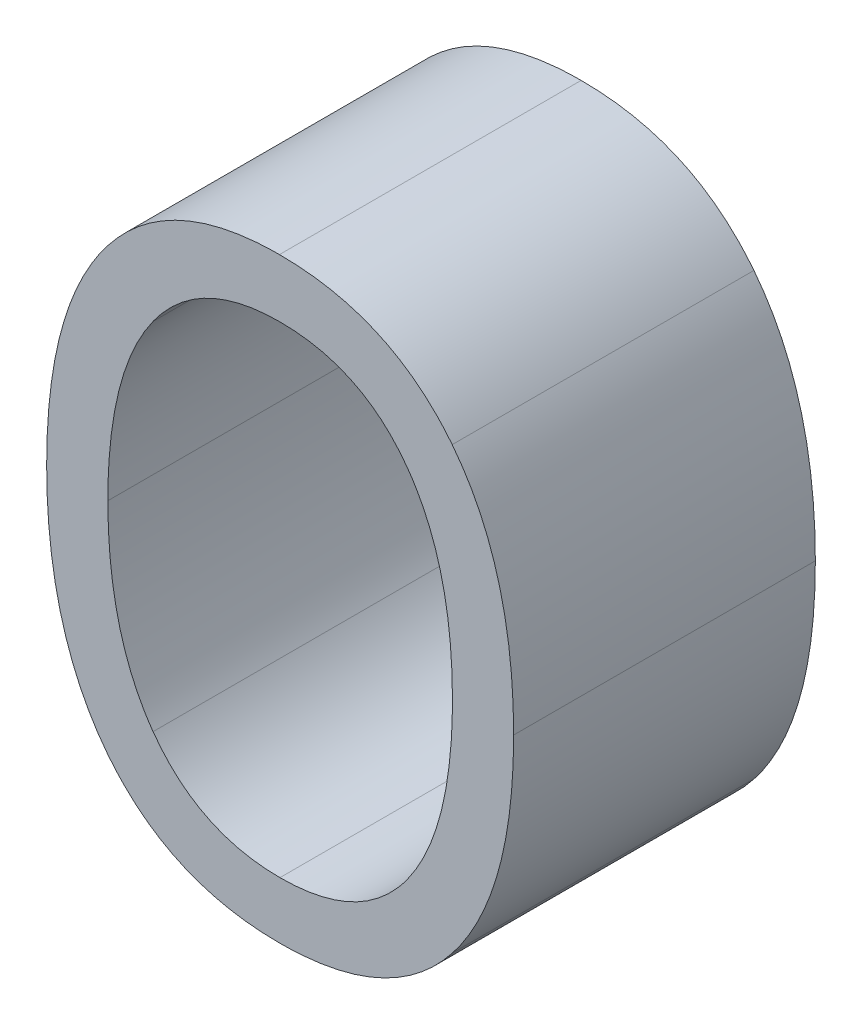
ISO-10303-21;
HEADER;
FILE_DESCRIPTION(('STEP AP214'),'2;1');
FILE_NAME('part.step','',(''),(''),'','','');
FILE_SCHEMA(('AUTOMOTIVE_DESIGN { 1 0 10303 214 1 1 1 1 }'));
ENDSEC;
DATA;
#1=APPLICATION_CONTEXT('core data for automotive mechanical design processes');
#2=APPLICATION_PROTOCOL_DEFINITION('international standard','automotive_design',2000,#1);
#3=PRODUCT_CONTEXT('',#1,'mechanical');
#4=PRODUCT('Part','Part','',(#3));
#5=PRODUCT_RELATED_PRODUCT_CATEGORY('part','',(#4));
#6=PRODUCT_DEFINITION_FORMATION('','',#4);
#7=PRODUCT_DEFINITION_CONTEXT('part definition',#1,'design');
#8=PRODUCT_DEFINITION('design','',#6,#7);
#9=PRODUCT_DEFINITION_SHAPE('','',#8);
#10=(LENGTH_UNIT() NAMED_UNIT(*) SI_UNIT(.MILLI.,.METRE.));
#11=(NAMED_UNIT(*) PLANE_ANGLE_UNIT() SI_UNIT($,.RADIAN.));
#12=(NAMED_UNIT(*) SI_UNIT($,.STERADIAN.) SOLID_ANGLE_UNIT());
#13=UNCERTAINTY_MEASURE_WITH_UNIT(LENGTH_MEASURE(1.E-05),#10,'distance_accuracy_value','');
#14=(GEOMETRIC_REPRESENTATION_CONTEXT(3) GLOBAL_UNCERTAINTY_ASSIGNED_CONTEXT((#13)) GLOBAL_UNIT_ASSIGNED_CONTEXT((#10,
#11,#12)) REPRESENTATION_CONTEXT('',''));
#15=CARTESIAN_POINT('',(0.,0.,0.));
#16=DIRECTION('',(0.,0.,1.));
#17=DIRECTION('',(1.,0.,0.));
#18=AXIS2_PLACEMENT_3D('',#15,#16,#17);
#19=CARTESIAN_POINT('',(12.845372113635,-5.202102016968,19.1980562554051));
#20=CARTESIAN_POINT('',(12.845372113635,-5.202102016968,20.2019437445948));
#21=CARTESIAN_POINT('',(12.845372113635,-5.454750172523,19.1980562554051));
#22=CARTESIAN_POINT('',(12.845372113635,-5.454750172523,20.2019437445948));
#23=CARTESIAN_POINT('',(12.895333913635,-5.650612394746,19.1980562554051));
#24=CARTESIAN_POINT('',(12.895333913635,-5.650612394746,20.2019437445948));
#25=CARTESIAN_POINT('',(12.995294202523,-5.789956794746,19.1980562554051));
#26=CARTESIAN_POINT('',(12.995294202523,-5.789956794746,20.2019437445948));
#27=(BOUNDED_SURFACE() B_SPLINE_SURFACE(3,1,((#19,#20),(#21,#22),(#23,#24),(#25,#26)),
.UNSPECIFIED.,.F.,.F.,.F.) B_SPLINE_SURFACE_WITH_KNOTS((4,4),(2,2),(0.,1.),(-1.00194374459485,
0.00194374459484818),
.UNSPECIFIED.) GEOMETRIC_REPRESENTATION_ITEM() RATIONAL_B_SPLINE_SURFACE(((1.,1.),(1.,1.),(1.,
1.),(1.,1.))) REPRESENTATION_ITEM('') SURFACE());
#28=DIRECTION('',(0.,0.,-1.));
#29=VECTOR('',#28,1.);
#30=CARTESIAN_POINT('',(12.845372113635,-5.202102016968,20.2));
#31=LINE('',#30,#29);
#32=CARTESIAN_POINT('',(12.845372113635,-5.202102016968,20.2));
#33=VERTEX_POINT('',#32);
#34=CARTESIAN_POINT('',(12.845372113635,-5.202102016968,19.2));
#35=VERTEX_POINT('',#34);
#36=EDGE_CURVE('E218',#33,#35,#31,.T.);
#37=CARTESIAN_POINT('',(12.845372113635,-5.202102016968,20.2));
#38=CARTESIAN_POINT('',(12.845372113635,-5.454750172523,20.2));
#39=CARTESIAN_POINT('',(12.895333913635,-5.650612394746,20.2));
#40=CARTESIAN_POINT('',(12.995294202523,-5.789956794746,20.2));
#41=(BOUNDED_CURVE() B_SPLINE_CURVE(3,(#37,#38,#39,#40),.UNSPECIFIED.,.F.,
.F.) B_SPLINE_CURVE_WITH_KNOTS((4,4),(0.,1.),
.UNSPECIFIED.) CURVE() GEOMETRIC_REPRESENTATION_ITEM() RATIONAL_B_SPLINE_CURVE((1.,1.,1.,1.)) REPRESENTATION_ITEM(''));
#42=CARTESIAN_POINT('',(12.995294202523,-5.789956794746,20.2));
#43=VERTEX_POINT('',#42);
#44=EDGE_CURVE('E210',#33,#43,#41,.T.);
#45=DIRECTION('',(0.,0.,-1.));
#46=VECTOR('',#45,1.);
#47=CARTESIAN_POINT('',(12.995294202523,-5.789956794746,20.2));
#48=LINE('',#47,#46);
#49=CARTESIAN_POINT('',(12.995294202523,-5.789956794746,19.2));
#50=VERTEX_POINT('',#49);
#51=EDGE_CURVE('E11',#43,#50,#48,.T.);
#52=CARTESIAN_POINT('',(12.845372113635,-5.202102016968,19.2));
#53=CARTESIAN_POINT('',(12.845372113635,-5.454750172523,19.2));
#54=CARTESIAN_POINT('',(12.895333913635,-5.650612394746,19.2));
#55=CARTESIAN_POINT('',(12.995294202523,-5.789956794746,19.2));
#56=(BOUNDED_CURVE() B_SPLINE_CURVE(3,(#52,#53,#54,#55),.UNSPECIFIED.,.F.,
.F.) B_SPLINE_CURVE_WITH_KNOTS((4,4),(0.,1.),
.UNSPECIFIED.) CURVE() GEOMETRIC_REPRESENTATION_ITEM() RATIONAL_B_SPLINE_CURVE((1.,1.,1.,1.)) REPRESENTATION_ITEM(''));
#57=EDGE_CURVE('E261',#35,#50,#56,.T.);
#58=ORIENTED_EDGE('',*,*,#36,.F.);
#59=ORIENTED_EDGE('',*,*,#44,.T.);
#60=ORIENTED_EDGE('',*,*,#51,.T.);
#61=ORIENTED_EDGE('',*,*,#57,.F.);
#62=EDGE_LOOP('',(#58,#59,#60,#61));
#63=FACE_BOUND('',#62,.T.);
#64=ADVANCED_FACE('F16',(#63),#27,.F.);
#65=CARTESIAN_POINT('',(12.9946550410688,-5.78906137786805,20.2));
#66=CARTESIAN_POINT('',(13.0598986488812,-5.88064048084759,20.2));
#67=CARTESIAN_POINT('',(13.1484518910841,-5.93224256062874,20.2));
#68=CARTESIAN_POINT('',(13.2631544786489,-5.99908248571093,20.2));
#69=CARTESIAN_POINT('',(13.4169237018795,-5.9988285000379,20.2));
#70=CARTESIAN_POINT('',(12.9946550410688,-5.78906137786805,19.2));
#71=CARTESIAN_POINT('',(13.0598986488812,-5.88064048084759,19.2));
#72=CARTESIAN_POINT('',(13.1484518910841,-5.93224256062874,19.2));
#73=CARTESIAN_POINT('',(13.2631544786489,-5.99908248571093,19.2));
#74=CARTESIAN_POINT('',(13.4169237018795,-5.9988285000379,19.2));
#75=(BOUNDED_SURFACE() B_SPLINE_SURFACE(1,2,((#65,#66,#67,#68,#69),(#70,#71,#72,#73,#74)),
.UNSPECIFIED.,.F.,.F.,.F.) B_SPLINE_SURFACE_WITH_KNOTS((2,2),(3,2,3),(-0.00256900553011785,
-5.46000193475974E-06),(1218.83450245022,1225.48736468761,1234.09670033903),
.UNSPECIFIED.) GEOMETRIC_REPRESENTATION_ITEM() RATIONAL_B_SPLINE_SURFACE(((0.993708881512202,
0.99681991297311,1.,0.995884713129732,0.991885069674449),(0.993708881512202,0.99681991297311,1.,
0.995884713129732,0.991885069674449))) REPRESENTATION_ITEM('') SURFACE());
#76=CARTESIAN_POINT('',(209.550479759414,331.109162418287,20.2));
#77=DIRECTION('',(0.,0.,1.));
#78=DIRECTION('',(-0.503477999588942,-0.864008046218273,0.));
#79=AXIS2_PLACEMENT_3D('',#76,#77,#78);
#80=ELLIPSE('',#79,390.090585916747,13.3073614936405);
#81=CARTESIAN_POINT('',(13.415760158079,-5.998829461412,20.2));
#82=VERTEX_POINT('',#81);
#83=EDGE_CURVE('E241',#43,#82,#80,.T.);
#84=DIRECTION('',(0.,0.,-1.));
#85=VECTOR('',#84,1.);
#86=CARTESIAN_POINT('',(13.415760158079,-5.998829461412,20.2));
#87=LINE('',#86,#85);
#88=CARTESIAN_POINT('',(13.415760158079,-5.998829461412,19.2));
#89=VERTEX_POINT('',#88);
#90=EDGE_CURVE('E29',#82,#89,#87,.T.);
#91=CARTESIAN_POINT('',(209.550479759414,331.109162418287,19.2));
#92=DIRECTION('',(0.,0.,1.));
#93=DIRECTION('',(-0.503477999588942,-0.864008046218273,0.));
#94=AXIS2_PLACEMENT_3D('',#91,#92,#93);
#95=ELLIPSE('',#94,390.090585916747,13.3073614936405);
#96=EDGE_CURVE('E267',#50,#89,#95,.T.);
#97=ORIENTED_EDGE('',*,*,#51,.F.);
#98=ORIENTED_EDGE('',*,*,#83,.T.);
#99=ORIENTED_EDGE('',*,*,#90,.T.);
#100=ORIENTED_EDGE('',*,*,#96,.F.);
#101=EDGE_LOOP('',(#97,#98,#99,#100));
#102=FACE_BOUND('',#101,.T.);
#103=ADVANCED_FACE('F385',(#102),#75,.F.);
#104=CARTESIAN_POINT('',(13.415760158079,-5.998829461412,19.1978766574813));
#105=CARTESIAN_POINT('',(13.415760158079,-5.998829461412,20.2021233425187));
#106=CARTESIAN_POINT('',(13.598420024746,-5.998829461412,19.1978766574813));
#107=CARTESIAN_POINT('',(13.598420024746,-5.998829461412,20.2021233425187));
#108=CARTESIAN_POINT('',(13.739466224746,-5.929907972523,19.1978766574813));
#109=CARTESIAN_POINT('',(13.739466224746,-5.929907972523,20.2021233425187));
#110=CARTESIAN_POINT('',(13.838743535857,-5.791743261412,19.1978766574813));
#111=CARTESIAN_POINT('',(13.838743535857,-5.791743261412,20.2021233425187));
#112=(BOUNDED_SURFACE() B_SPLINE_SURFACE(3,1,((#104,#105),(#106,#107),(#108,#109),(#110,#111)),
.UNSPECIFIED.,.F.,.F.,.F.) B_SPLINE_SURFACE_WITH_KNOTS((4,4),(2,2),(0.,1.),(-1.00212334251875,
0.00212334251874949),
.UNSPECIFIED.) GEOMETRIC_REPRESENTATION_ITEM() RATIONAL_B_SPLINE_SURFACE(((1.,1.),(1.,1.),(1.,
1.),(1.,1.))) REPRESENTATION_ITEM('') SURFACE());
#113=CARTESIAN_POINT('',(13.415760158079,-5.998829461412,20.2));
#114=CARTESIAN_POINT('',(13.598420024746,-5.998829461412,20.2));
#115=CARTESIAN_POINT('',(13.739466224746,-5.929907972523,20.2));
#116=CARTESIAN_POINT('',(13.838743535857,-5.791743261412,20.2));
#117=(BOUNDED_CURVE() B_SPLINE_CURVE(3,(#113,#114,#115,#116),.UNSPECIFIED.,.F.,
.F.) B_SPLINE_CURVE_WITH_KNOTS((4,4),(0.,1.),
.UNSPECIFIED.) CURVE() GEOMETRIC_REPRESENTATION_ITEM() RATIONAL_B_SPLINE_CURVE((1.,1.,1.,1.)) REPRESENTATION_ITEM(''));
#118=CARTESIAN_POINT('',(13.838743535857,-5.791743261412,20.2));
#119=VERTEX_POINT('',#118);
#120=EDGE_CURVE('E235',#82,#119,#117,.T.);
#121=DIRECTION('',(0.,0.,-1.));
#122=VECTOR('',#121,1.);
#123=CARTESIAN_POINT('',(13.838743535857,-5.791743261412,20.2));
#124=LINE('',#123,#122);
#125=CARTESIAN_POINT('',(13.838743535857,-5.791743261412,19.2));
#126=VERTEX_POINT('',#125);
#127=EDGE_CURVE('E234',#119,#126,#124,.T.);
#128=CARTESIAN_POINT('',(13.415760158079,-5.998829461412,19.2));
#129=CARTESIAN_POINT('',(13.598420024746,-5.998829461412,19.2));
#130=CARTESIAN_POINT('',(13.739466224746,-5.929907972523,19.2));
#131=CARTESIAN_POINT('',(13.838743535857,-5.791743261412,19.2));
#132=(BOUNDED_CURVE() B_SPLINE_CURVE(3,(#128,#129,#130,#131),.UNSPECIFIED.,.F.,
.F.) B_SPLINE_CURVE_WITH_KNOTS((4,4),(0.,1.),
.UNSPECIFIED.) CURVE() GEOMETRIC_REPRESENTATION_ITEM() RATIONAL_B_SPLINE_CURVE((1.,1.,1.,1.)) REPRESENTATION_ITEM(''));
#133=EDGE_CURVE('E280',#89,#126,#132,.T.);
#134=ORIENTED_EDGE('',*,*,#90,.F.);
#135=ORIENTED_EDGE('',*,*,#120,.T.);
#136=ORIENTED_EDGE('',*,*,#127,.T.);
#137=ORIENTED_EDGE('',*,*,#133,.F.);
#138=EDGE_LOOP('',(#134,#135,#136,#137));
#139=FACE_BOUND('',#138,.T.);
#140=ADVANCED_FACE('F389',(#139),#112,.F.);
#141=CARTESIAN_POINT('',(13.838743535857,-5.791743261412,19.1980431764449));
#142=CARTESIAN_POINT('',(13.838743535857,-5.791743261412,20.2019568235551));
#143=CARTESIAN_POINT('',(13.938173246968,-5.653428972523,19.1980431764449));
#144=CARTESIAN_POINT('',(13.938173246968,-5.653428972523,20.2019568235551));
#145=CARTESIAN_POINT('',(13.987610113635,-5.457129305857,19.1980431764449));
#146=CARTESIAN_POINT('',(13.987610113635,-5.457129305857,20.2019568235551));
#147=CARTESIAN_POINT('',(13.987610113635,-5.202102016968,19.1980431764449));
#148=CARTESIAN_POINT('',(13.987610113635,-5.202102016968,20.2019568235551));
#149=(BOUNDED_SURFACE() B_SPLINE_SURFACE(3,1,((#141,#142),(#143,#144),(#145,#146),(#147,#148)),
.UNSPECIFIED.,.F.,.F.,.F.) B_SPLINE_SURFACE_WITH_KNOTS((4,4),(2,2),(0.,1.),(-1.00195682355515,
0.00195682355515335),
.UNSPECIFIED.) GEOMETRIC_REPRESENTATION_ITEM() RATIONAL_B_SPLINE_SURFACE(((1.,1.),(1.,1.),(1.,
1.),(1.,1.))) REPRESENTATION_ITEM('') SURFACE());
#150=CARTESIAN_POINT('',(13.838743535857,-5.791743261412,20.2));
#151=CARTESIAN_POINT('',(13.938173246968,-5.653428972523,20.2));
#152=CARTESIAN_POINT('',(13.987610113635,-5.457129305857,20.2));
#153=CARTESIAN_POINT('',(13.987610113635,-5.202102016968,20.2));
#154=(BOUNDED_CURVE() B_SPLINE_CURVE(3,(#150,#151,#152,#153),.UNSPECIFIED.,.F.,
.F.) B_SPLINE_CURVE_WITH_KNOTS((4,4),(0.,1.),
.UNSPECIFIED.) CURVE() GEOMETRIC_REPRESENTATION_ITEM() RATIONAL_B_SPLINE_CURVE((1.,1.,1.,1.)) REPRESENTATION_ITEM(''));
#155=CARTESIAN_POINT('',(13.987610113635,-5.202102016968,20.2));
#156=VERTEX_POINT('',#155);
#157=EDGE_CURVE('E242',#119,#156,#154,.T.);
#158=DIRECTION('',(0.,0.,-1.));
#159=VECTOR('',#158,1.);
#160=CARTESIAN_POINT('',(13.987610113635,-5.202102016968,20.2));
#161=LINE('',#160,#159);
#162=CARTESIAN_POINT('',(13.987610113635,-5.202102016968,19.2));
#163=VERTEX_POINT('',#162);
#164=EDGE_CURVE('E299',#156,#163,#161,.T.);
#165=CARTESIAN_POINT('',(13.838743535857,-5.791743261412,19.2));
#166=CARTESIAN_POINT('',(13.938173246968,-5.653428972523,19.2));
#167=CARTESIAN_POINT('',(13.987610113635,-5.457129305857,19.2));
#168=CARTESIAN_POINT('',(13.987610113635,-5.202102016968,19.2));
#169=(BOUNDED_CURVE() B_SPLINE_CURVE(3,(#165,#166,#167,#168),.UNSPECIFIED.,.F.,
.F.) B_SPLINE_CURVE_WITH_KNOTS((4,4),(0.,1.),
.UNSPECIFIED.) CURVE() GEOMETRIC_REPRESENTATION_ITEM() RATIONAL_B_SPLINE_CURVE((1.,1.,1.,1.)) REPRESENTATION_ITEM(''));
#170=EDGE_CURVE('E286',#126,#163,#169,.T.);
#171=ORIENTED_EDGE('',*,*,#127,.F.);
#172=ORIENTED_EDGE('',*,*,#157,.T.);
#173=ORIENTED_EDGE('',*,*,#164,.T.);
#174=ORIENTED_EDGE('',*,*,#170,.F.);
#175=EDGE_LOOP('',(#171,#172,#173,#174));
#176=FACE_BOUND('',#175,.T.);
#177=ADVANCED_FACE('F391',(#176),#149,.F.);
#178=CARTESIAN_POINT('',(13.987610113635,-5.202102016968,19.1980474078437));
#179=CARTESIAN_POINT('',(13.987610113635,-5.202102016968,20.2019525921563));
#180=CARTESIAN_POINT('',(13.987610113635,-4.94692232807888,19.1980474078437));
#181=CARTESIAN_POINT('',(13.987610113635,-4.94692232807888,20.2019525921563));
#182=CARTESIAN_POINT('',(13.938173246968,-4.750334794746,19.1980474078437));
#183=CARTESIAN_POINT('',(13.938173246968,-4.750334794746,20.2019525921563));
#184=CARTESIAN_POINT('',(13.838743535857,-4.611566128079,19.1980474078437));
#185=CARTESIAN_POINT('',(13.838743535857,-4.611566128079,20.2019525921563));
#186=(BOUNDED_SURFACE() B_SPLINE_SURFACE(3,1,((#178,#179),(#180,#181),(#182,#183),(#184,#185)),
.UNSPECIFIED.,.F.,.F.,.F.) B_SPLINE_SURFACE_WITH_KNOTS((4,4),(2,2),(0.,1.),(-1.00195259215628,
0.00195259215627952),
.UNSPECIFIED.) GEOMETRIC_REPRESENTATION_ITEM() RATIONAL_B_SPLINE_SURFACE(((1.,1.),(1.,1.),(1.,
1.),(1.,1.))) REPRESENTATION_ITEM('') SURFACE());
#187=CARTESIAN_POINT('',(13.987610113635,-5.202102016968,20.2));
#188=CARTESIAN_POINT('',(13.987610113635,-4.94692232807888,20.2));
#189=CARTESIAN_POINT('',(13.938173246968,-4.750334794746,20.2));
#190=CARTESIAN_POINT('',(13.838743535857,-4.611566128079,20.2));
#191=(BOUNDED_CURVE() B_SPLINE_CURVE(3,(#187,#188,#189,#190),.UNSPECIFIED.,.F.,
.F.) B_SPLINE_CURVE_WITH_KNOTS((4,4),(0.,1.),
.UNSPECIFIED.) CURVE() GEOMETRIC_REPRESENTATION_ITEM() RATIONAL_B_SPLINE_CURVE((1.,1.,1.,1.)) REPRESENTATION_ITEM(''));
#192=CARTESIAN_POINT('',(13.838743535857,-4.611566128079,20.2));
#193=VERTEX_POINT('',#192);
#194=EDGE_CURVE('E293',#156,#193,#191,.T.);
#195=DIRECTION('',(0.,0.,-1.));
#196=VECTOR('',#195,1.);
#197=CARTESIAN_POINT('',(13.838743535857,-4.611566128079,20.2));
#198=LINE('',#197,#196);
#199=CARTESIAN_POINT('',(13.838743535857,-4.611566128079,19.2));
#200=VERTEX_POINT('',#199);
#201=EDGE_CURVE('E304',#193,#200,#198,.T.);
#202=CARTESIAN_POINT('',(13.987610113635,-5.202102016968,19.2));
#203=CARTESIAN_POINT('',(13.987610113635,-4.94692232807888,19.2));
#204=CARTESIAN_POINT('',(13.938173246968,-4.750334794746,19.2));
#205=CARTESIAN_POINT('',(13.838743535857,-4.611566128079,19.2));
#206=(BOUNDED_CURVE() B_SPLINE_CURVE(3,(#202,#203,#204,#205),.UNSPECIFIED.,.F.,
.F.) B_SPLINE_CURVE_WITH_KNOTS((4,4),(0.,1.),
.UNSPECIFIED.) CURVE() GEOMETRIC_REPRESENTATION_ITEM() RATIONAL_B_SPLINE_CURVE((1.,1.,1.,1.)) REPRESENTATION_ITEM(''));
#207=EDGE_CURVE('E276',#163,#200,#206,.T.);
#208=ORIENTED_EDGE('',*,*,#164,.F.);
#209=ORIENTED_EDGE('',*,*,#194,.T.);
#210=ORIENTED_EDGE('',*,*,#201,.T.);
#211=ORIENTED_EDGE('',*,*,#207,.F.);
#212=EDGE_LOOP('',(#208,#209,#210,#211));
#213=FACE_BOUND('',#212,.T.);
#214=ADVANCED_FACE('F547',(#213),#186,.F.);
#215=CARTESIAN_POINT('',(13.8393819000687,-4.6124590884921,20.2));
#216=CARTESIAN_POINT('',(13.77673225859,-4.52465023678422,20.2));
#217=CARTESIAN_POINT('',(13.6918840029394,-4.47370963759874,20.2));
#218=CARTESIAN_POINT('',(13.5743992194346,-4.40317494927755,20.2));
#219=CARTESIAN_POINT('',(13.414579808065,-4.40343667290015,20.2));
#220=CARTESIAN_POINT('',(13.8393819000687,-4.6124590884921,19.2));
#221=CARTESIAN_POINT('',(13.77673225859,-4.52465023678422,19.2));
#222=CARTESIAN_POINT('',(13.6918840029394,-4.47370963759874,19.2));
#223=CARTESIAN_POINT('',(13.5743992194346,-4.40317494927755,19.2));
#224=CARTESIAN_POINT('',(13.414579808065,-4.40343667290015,19.2));
#225=(BOUNDED_SURFACE() B_SPLINE_SURFACE(1,2,((#215,#216,#217,#218,#219),(#220,#221,#222,#223,
#224)),.UNSPECIFIED.,.F.,.F.,.F.) B_SPLINE_SURFACE_WITH_KNOTS((2,2),(3,2,3),(-0.012892932120337,
-2.72865621927989E-05),(485.515617323469,488.369221644088,492.310076105789),
.UNSPECIFIED.) GEOMETRIC_REPRESENTATION_ITEM() RATIONAL_B_SPLINE_SURFACE(((0.986628697497616,
0.993154348655532,1.,0.990546090973734,0.981702482153386),(0.986628697497616,0.993154348655532,
1.,0.990546090973734,0.981702482153386))) REPRESENTATION_ITEM('') SURFACE());
#226=CARTESIAN_POINT('',(-26.3164221160557,-71.1127796139471,20.2));
#227=DIRECTION('',(0.,0.,1.));
#228=DIRECTION('',(-0.514730951425069,-0.857351764239768,0.));
#229=AXIS2_PLACEMENT_3D('',#226,#227,#228);
#230=ELLIPSE('',#229,77.7266376855847,5.94717689821132);
#231=CARTESIAN_POINT('',(13.415760158079,-4.403435705857,20.2));
#232=VERTEX_POINT('',#231);
#233=EDGE_CURVE('E287',#193,#232,#230,.T.);
#234=DIRECTION('',(0.,0.,-1.));
#235=VECTOR('',#234,1.);
#236=CARTESIAN_POINT('',(13.415760158079,-4.403435705857,20.2));
#237=LINE('',#236,#235);
#238=CARTESIAN_POINT('',(13.415760158079,-4.403435705857,19.2));
#239=VERTEX_POINT('',#238);
#240=EDGE_CURVE('E43',#232,#239,#237,.T.);
#241=CARTESIAN_POINT('',(-26.3164221160557,-71.1127796139471,19.2));
#242=DIRECTION('',(0.,0.,1.));
#243=DIRECTION('',(-0.514730951425069,-0.857351764239768,0.));
#244=AXIS2_PLACEMENT_3D('',#241,#242,#243);
#245=ELLIPSE('',#244,77.7266376855847,5.94717689821132);
#246=EDGE_CURVE('E269',#200,#239,#245,.T.);
#247=ORIENTED_EDGE('',*,*,#201,.F.);
#248=ORIENTED_EDGE('',*,*,#233,.T.);
#249=ORIENTED_EDGE('',*,*,#240,.T.);
#250=ORIENTED_EDGE('',*,*,#246,.F.);
#251=EDGE_LOOP('',(#247,#248,#249,#250));
#252=FACE_BOUND('',#251,.T.);
#253=ADVANCED_FACE('F527',(#252),#225,.F.);
#254=CARTESIAN_POINT('',(13.4169312089563,-4.40343668207427,20.2));
#255=CARTESIAN_POINT('',(13.2635550469239,-4.40318109202146,20.2));
#256=CARTESIAN_POINT('',(13.1489296595074,-4.46981451945261,20.2));
#257=CARTESIAN_POINT('',(13.0600990763809,-4.5214530469013,20.2));
#258=CARTESIAN_POINT('',(12.9946508825934,-4.61320852043163,20.2));
#259=CARTESIAN_POINT('',(13.4169312089563,-4.40343668207427,19.2));
#260=CARTESIAN_POINT('',(13.2635550469239,-4.40318109202146,19.2));
#261=CARTESIAN_POINT('',(13.1489296595074,-4.46981451945261,19.2));
#262=CARTESIAN_POINT('',(13.0600990763809,-4.5214530469013,19.2));
#263=CARTESIAN_POINT('',(12.9946508825934,-4.61320852043163,19.2));
#264=(BOUNDED_SURFACE() B_SPLINE_SURFACE(1,2,((#254,#255,#256,#257,#258),(#259,#260,#261,#262,
#263)),.UNSPECIFIED.,.F.,.F.,.F.) B_SPLINE_SURFACE_WITH_KNOTS((2,2),(3,2,3),
(-0.0112254479964483,-2.38551372726669E-05),(556.826833136152,560.918914494632,
564.096242667084),
.UNSPECIFIED.) GEOMETRIC_REPRESENTATION_ITEM() RATIONAL_B_SPLINE_SURFACE(((0.983404833046798,
0.991453004348684,1.,0.993363619221187,0.987027972955926),(0.983404833046798,0.991453004348684,
1.,0.993363619221187,0.987027972955926))) REPRESENTATION_ITEM('') SURFACE());
#265=CARTESIAN_POINT('',(58.0152925960453,-81.650658628375,20.2));
#266=DIRECTION('',(0.,0.,1.));
#267=DIRECTION('',(0.502568377675033,-0.864537463480378,0.));
#268=AXIS2_PLACEMENT_3D('',#265,#266,#267);
#269=ELLIPSE('',#268,89.2741464284298,6.37063475065418);
#270=CARTESIAN_POINT('',(12.995294202523,-4.612308372523,20.2));
#271=VERTEX_POINT('',#270);
#272=EDGE_CURVE('E294',#232,#271,#269,.T.);
#273=DIRECTION('',(0.,0.,-1.));
#274=VECTOR('',#273,1.);
#275=CARTESIAN_POINT('',(12.995294202523,-4.612308372523,20.2));
#276=LINE('',#275,#274);
#277=CARTESIAN_POINT('',(12.995294202523,-4.612308372523,19.2));
#278=VERTEX_POINT('',#277);
#279=EDGE_CURVE('E192',#271,#278,#276,.T.);
#280=CARTESIAN_POINT('',(58.0152925960453,-81.650658628375,19.2));
#281=DIRECTION('',(0.,0.,1.));
#282=DIRECTION('',(0.502568377675033,-0.864537463480378,0.));
#283=AXIS2_PLACEMENT_3D('',#280,#281,#282);
#284=ELLIPSE('',#283,89.2741464284298,6.37063475065418);
#285=EDGE_CURVE('E22',#239,#278,#284,.T.);
#286=ORIENTED_EDGE('',*,*,#240,.F.);
#287=ORIENTED_EDGE('',*,*,#272,.T.);
#288=ORIENTED_EDGE('',*,*,#279,.T.);
#289=ORIENTED_EDGE('',*,*,#285,.F.);
#290=EDGE_LOOP('',(#286,#287,#288,#289));
#291=FACE_BOUND('',#290,.T.);
#292=ADVANCED_FACE('F517',(#291),#264,.F.);
#293=CARTESIAN_POINT('',(12.995294202523,-4.612308372523,19.1980562294128));
#294=CARTESIAN_POINT('',(12.995294202523,-4.612308372523,20.2019437705871));
#295=CARTESIAN_POINT('',(12.895333913635,-4.751649950301,19.1980562294128));
#296=CARTESIAN_POINT('',(12.895333913635,-4.751649950301,20.2019437705871));
#297=CARTESIAN_POINT('',(12.845372113635,-4.94810201696777,19.1980562294128));
#298=CARTESIAN_POINT('',(12.845372113635,-4.94810201696777,20.2019437705871));
#299=CARTESIAN_POINT('',(12.845372113635,-5.202102016968,19.1980562294128));
#300=CARTESIAN_POINT('',(12.845372113635,-5.202102016968,20.2019437705871));
#301=(BOUNDED_SURFACE() B_SPLINE_SURFACE(3,1,((#293,#294),(#295,#296),(#297,#298),(#299,#300)),
.UNSPECIFIED.,.F.,.F.,.F.) B_SPLINE_SURFACE_WITH_KNOTS((4,4),(2,2),(0.,1.),(-1.00194377058717,
0.00194377058717216),
.UNSPECIFIED.) GEOMETRIC_REPRESENTATION_ITEM() RATIONAL_B_SPLINE_SURFACE(((1.,1.),(1.,1.),(1.,
1.),(1.,1.))) REPRESENTATION_ITEM('') SURFACE());
#302=CARTESIAN_POINT('',(12.995294202523,-4.612308372523,20.2));
#303=CARTESIAN_POINT('',(12.895333913635,-4.751649950301,20.2));
#304=CARTESIAN_POINT('',(12.845372113635,-4.94810201696777,20.2));
#305=CARTESIAN_POINT('',(12.845372113635,-5.202102016968,20.2));
#306=(BOUNDED_CURVE() B_SPLINE_CURVE(3,(#302,#303,#304,#305),.UNSPECIFIED.,.F.,
.F.) B_SPLINE_CURVE_WITH_KNOTS((4,4),(0.,1.),
.UNSPECIFIED.) CURVE() GEOMETRIC_REPRESENTATION_ITEM() RATIONAL_B_SPLINE_CURVE((1.,1.,1.,1.)) REPRESENTATION_ITEM(''));
#307=EDGE_CURVE('E327',#271,#33,#306,.T.);
#308=CARTESIAN_POINT('',(12.995294202523,-4.612308372523,19.2));
#309=CARTESIAN_POINT('',(12.895333913635,-4.751649950301,19.2));
#310=CARTESIAN_POINT('',(12.845372113635,-4.94810201696777,19.2));
#311=CARTESIAN_POINT('',(12.845372113635,-5.202102016968,19.2));
#312=(BOUNDED_CURVE() B_SPLINE_CURVE(3,(#308,#309,#310,#311),.UNSPECIFIED.,.F.,
.F.) B_SPLINE_CURVE_WITH_KNOTS((4,4),(0.,1.),
.UNSPECIFIED.) CURVE() GEOMETRIC_REPRESENTATION_ITEM() RATIONAL_B_SPLINE_CURVE((1.,1.,1.,1.)) REPRESENTATION_ITEM(''));
#313=EDGE_CURVE('E268',#278,#35,#312,.T.);
#314=ORIENTED_EDGE('',*,*,#279,.F.);
#315=ORIENTED_EDGE('',*,*,#307,.T.);
#316=ORIENTED_EDGE('',*,*,#36,.T.);
#317=ORIENTED_EDGE('',*,*,#313,.F.);
#318=EDGE_LOOP('',(#314,#315,#316,#317));
#319=FACE_BOUND('',#318,.T.);
#320=ADVANCED_FACE('F526',(#319),#301,.F.);
#321=CARTESIAN_POINT('',(14.190426291412,-5.202102016968,19.1984790596981));
#322=CARTESIAN_POINT('',(14.190426291412,-5.202102016968,20.2015209403019));
#323=CARTESIAN_POINT('',(14.190426291412,-5.51452483919,19.1984790596981));
#324=CARTESIAN_POINT('',(14.190426291412,-5.51452483919,20.2015209403019));
#325=CARTESIAN_POINT('',(14.122817135857,-5.756829550301,19.1984790596981));
#326=CARTESIAN_POINT('',(14.122817135857,-5.756829550301,20.2015209403019));
#327=CARTESIAN_POINT('',(13.987610113635,-5.929315305857,19.1984790596981));
#328=CARTESIAN_POINT('',(13.987610113635,-5.929315305857,20.2015209403019));
#329=(BOUNDED_SURFACE() B_SPLINE_SURFACE(3,1,((#321,#322),(#323,#324),(#325,#326),(#327,#328)),
.UNSPECIFIED.,.F.,.F.,.F.) B_SPLINE_SURFACE_WITH_KNOTS((4,4),(2,2),(0.,1.),(-1.0015209403019,
0.00152094030190094),
.UNSPECIFIED.) GEOMETRIC_REPRESENTATION_ITEM() RATIONAL_B_SPLINE_SURFACE(((1.,1.),(1.,1.),(1.,
1.),(1.,1.))) REPRESENTATION_ITEM('') SURFACE());
#330=DIRECTION('',(0.,0.,-1.));
#331=VECTOR('',#330,1.);
#332=CARTESIAN_POINT('',(14.190426291412,-5.202102016968,20.2));
#333=LINE('',#332,#331);
#334=CARTESIAN_POINT('',(14.190426291412,-5.202102016968,20.2));
#335=VERTEX_POINT('',#334);
#336=CARTESIAN_POINT('',(14.190426291412,-5.202102016968,19.2));
#337=VERTEX_POINT('',#336);
#338=EDGE_CURVE('E180',#335,#337,#333,.T.);
#339=CARTESIAN_POINT('',(14.190426291412,-5.202102016968,20.2));
#340=CARTESIAN_POINT('',(14.190426291412,-5.51452483919,20.2));
#341=CARTESIAN_POINT('',(14.122817135857,-5.756829550301,20.2));
#342=CARTESIAN_POINT('',(13.987610113635,-5.929315305857,20.2));
#343=(BOUNDED_CURVE() B_SPLINE_CURVE(3,(#339,#340,#341,#342),.UNSPECIFIED.,.F.,
.F.) B_SPLINE_CURVE_WITH_KNOTS((4,4),(0.,1.),
.UNSPECIFIED.) CURVE() GEOMETRIC_REPRESENTATION_ITEM() RATIONAL_B_SPLINE_CURVE((1.,1.,1.,1.)) REPRESENTATION_ITEM(''));
#344=CARTESIAN_POINT('',(13.987610113635,-5.929315305857,20.2));
#345=VERTEX_POINT('',#344);
#346=EDGE_CURVE('E223',#335,#345,#343,.T.);
#347=DIRECTION('',(0.,0.,-1.));
#348=VECTOR('',#347,1.);
#349=CARTESIAN_POINT('',(13.987610113635,-5.929315305857,20.2));
#350=LINE('',#349,#348);
#351=CARTESIAN_POINT('',(13.987610113635,-5.929315305857,19.2));
#352=VERTEX_POINT('',#351);
#353=EDGE_CURVE('E193',#345,#352,#350,.T.);
#354=CARTESIAN_POINT('',(14.190426291412,-5.202102016968,19.2));
#355=CARTESIAN_POINT('',(14.190426291412,-5.51452483919,19.2));
#356=CARTESIAN_POINT('',(14.122817135857,-5.756829550301,19.2));
#357=CARTESIAN_POINT('',(13.987610113635,-5.929315305857,19.2));
#358=(BOUNDED_CURVE() B_SPLINE_CURVE(3,(#354,#355,#356,#357),.UNSPECIFIED.,.F.,
.F.) B_SPLINE_CURVE_WITH_KNOTS((4,4),(0.,1.),
.UNSPECIFIED.) CURVE() GEOMETRIC_REPRESENTATION_ITEM() RATIONAL_B_SPLINE_CURVE((1.,1.,1.,1.)) REPRESENTATION_ITEM(''));
#359=EDGE_CURVE('E196',#337,#352,#358,.T.);
#360=ORIENTED_EDGE('',*,*,#338,.F.);
#361=ORIENTED_EDGE('',*,*,#346,.T.);
#362=ORIENTED_EDGE('',*,*,#353,.T.);
#363=ORIENTED_EDGE('',*,*,#359,.F.);
#364=EDGE_LOOP('',(#360,#361,#362,#363));
#365=FACE_BOUND('',#364,.T.);
#366=ADVANCED_FACE('F197',(#365),#329,.F.);
#367=CARTESIAN_POINT('',(13.986819891412,-4.470296972523,19.198484250708));
#368=CARTESIAN_POINT('',(13.986819891412,-4.470296972523,20.201515749292));
#369=CARTESIAN_POINT('',(14.12268166919,-4.643222994746,19.198484250708));
#370=CARTESIAN_POINT('',(14.12268166919,-4.643222994746,20.201515749292));
#371=CARTESIAN_POINT('',(14.190426291412,-4.887012194746,19.198484250708));
#372=CARTESIAN_POINT('',(14.190426291412,-4.887012194746,20.201515749292));
#373=CARTESIAN_POINT('',(14.190426291412,-5.202102016968,19.198484250708));
#374=CARTESIAN_POINT('',(14.190426291412,-5.202102016968,20.201515749292));
#375=(BOUNDED_SURFACE() B_SPLINE_SURFACE(3,1,((#367,#368),(#369,#370),(#371,#372),(#373,#374)),
.UNSPECIFIED.,.F.,.F.,.F.) B_SPLINE_SURFACE_WITH_KNOTS((4,4),(2,2),(0.,1.),(-1.00151574929199,
0.00151574929198768),
.UNSPECIFIED.) GEOMETRIC_REPRESENTATION_ITEM() RATIONAL_B_SPLINE_SURFACE(((1.,1.),(1.,1.),(1.,
1.),(1.,1.))) REPRESENTATION_ITEM('') SURFACE());
#376=DIRECTION('',(0.,0.,-1.));
#377=VECTOR('',#376,1.);
#378=CARTESIAN_POINT('',(13.986819891412,-4.470296972523,20.2));
#379=LINE('',#378,#377);
#380=CARTESIAN_POINT('',(13.986819891412,-4.470296972523,20.2));
#381=VERTEX_POINT('',#380);
#382=CARTESIAN_POINT('',(13.986819891412,-4.470296972523,19.2));
#383=VERTEX_POINT('',#382);
#384=EDGE_CURVE('E216',#381,#383,#379,.T.);
#385=CARTESIAN_POINT('',(13.986819891412,-4.470296972523,20.2));
#386=CARTESIAN_POINT('',(14.12268166919,-4.643222994746,20.2));
#387=CARTESIAN_POINT('',(14.190426291412,-4.887012194746,20.2));
#388=CARTESIAN_POINT('',(14.190426291412,-5.202102016968,20.2));
#389=(BOUNDED_CURVE() B_SPLINE_CURVE(3,(#385,#386,#387,#388),.UNSPECIFIED.,.F.,
.F.) B_SPLINE_CURVE_WITH_KNOTS((4,4),(0.,1.),
.UNSPECIFIED.) CURVE() GEOMETRIC_REPRESENTATION_ITEM() RATIONAL_B_SPLINE_CURVE((1.,1.,1.,1.)) REPRESENTATION_ITEM(''));
#390=EDGE_CURVE('E187',#381,#335,#389,.T.);
#391=CARTESIAN_POINT('',(13.986819891412,-4.470296972523,19.2));
#392=CARTESIAN_POINT('',(14.12268166919,-4.643222994746,19.2));
#393=CARTESIAN_POINT('',(14.190426291412,-4.887012194746,19.2));
#394=CARTESIAN_POINT('',(14.190426291412,-5.202102016968,19.2));
#395=(BOUNDED_CURVE() B_SPLINE_CURVE(3,(#391,#392,#393,#394),.UNSPECIFIED.,.F.,
.F.) B_SPLINE_CURVE_WITH_KNOTS((4,4),(0.,1.),
.UNSPECIFIED.) CURVE() GEOMETRIC_REPRESENTATION_ITEM() RATIONAL_B_SPLINE_CURVE((1.,1.,1.,1.)) REPRESENTATION_ITEM(''));
#396=EDGE_CURVE('E184',#383,#337,#395,.T.);
#397=ORIENTED_EDGE('',*,*,#384,.F.);
#398=ORIENTED_EDGE('',*,*,#390,.T.);
#399=ORIENTED_EDGE('',*,*,#338,.T.);
#400=ORIENTED_EDGE('',*,*,#396,.F.);
#401=EDGE_LOOP('',(#397,#398,#399,#400));
#402=FACE_BOUND('',#401,.T.);
#403=ADVANCED_FACE('F182',(#402),#375,.F.);
#404=CARTESIAN_POINT('',(13.9882567811835,-5.92849122103062,20.2));
#405=CARTESIAN_POINT('',(13.9185836359748,-6.01740931564129,20.2));
#406=CARTESIAN_POINT('',(13.8289929408776,-6.07578510356661,20.2));
#407=CARTESIAN_POINT('',(13.6574342301728,-6.18756986985263,20.2));
#408=CARTESIAN_POINT('',(13.4129777431824,-6.18729679611756,20.2));
#409=CARTESIAN_POINT('',(13.9882567811835,-5.92849122103062,19.2));
#410=CARTESIAN_POINT('',(13.9185836359748,-6.01740931564129,19.2));
#411=CARTESIAN_POINT('',(13.8289929408776,-6.07578510356661,19.2));
#412=CARTESIAN_POINT('',(13.6574342301728,-6.18756986985263,19.2));
#413=CARTESIAN_POINT('',(13.4129777431824,-6.18729679611756,19.2));
#414=(BOUNDED_SURFACE() B_SPLINE_SURFACE(1,2,((#404,#405,#406,#407,#408),(#409,#410,#411,#412,
#413)),.UNSPECIFIED.,.F.,.F.,.F.) B_SPLINE_SURFACE_WITH_KNOTS((2,2),(3,2,3),
(-0.00359369498995271,-5.70579345374233E-06),(1746.18081720483,1751.17174636716,
1760.69985170681),
.UNSPECIFIED.) GEOMETRIC_REPRESENTATION_ITEM() RATIONAL_B_SPLINE_SURFACE(((0.993398046149816,
0.996660957304147,1.,0.993625485454726,0.987528440192302),(0.993398046149816,0.996660957304147,
1.,0.993625485454726,0.987528440192302))) REPRESENTATION_ITEM('') SURFACE());
#415=CARTESIAN_POINT('',(-138.322896140638,227.435284106273,20.2));
#416=DIRECTION('',(0.,0.,-1.));
#417=DIRECTION('',(-0.54592049954455,0.837836981862838,0.));
#418=AXIS2_PLACEMENT_3D('',#415,#416,#417);
#419=ELLIPSE('',#418,278.707044752663,13.2206465230422);
#420=CARTESIAN_POINT('',(13.414168424746,-6.187297461412,20.2));
#421=VERTEX_POINT('',#420);
#422=EDGE_CURVE('E228',#345,#421,#419,.T.);
#423=DIRECTION('',(0.,0.,-1.));
#424=VECTOR('',#423,1.);
#425=CARTESIAN_POINT('',(13.414168424746,-6.187297461412,20.2));
#426=LINE('',#425,#424);
#427=CARTESIAN_POINT('',(13.414168424746,-6.187297461412,19.2));
#428=VERTEX_POINT('',#427);
#429=EDGE_CURVE('E409',#421,#428,#426,.T.);
#430=CARTESIAN_POINT('',(-138.322896140638,227.435284106273,19.2));
#431=DIRECTION('',(0.,0.,-1.));
#432=DIRECTION('',(-0.54592049954455,0.837836981862838,0.));
#433=AXIS2_PLACEMENT_3D('',#430,#431,#432);
#434=ELLIPSE('',#433,278.707044752663,13.2206465230422);
#435=EDGE_CURVE('E200',#352,#428,#434,.T.);
#436=ORIENTED_EDGE('',*,*,#353,.F.);
#437=ORIENTED_EDGE('',*,*,#422,.T.);
#438=ORIENTED_EDGE('',*,*,#429,.T.);
#439=ORIENTED_EDGE('',*,*,#435,.F.);
#440=EDGE_LOOP('',(#436,#437,#438,#439));
#441=FACE_BOUND('',#440,.T.);
#442=ADVANCED_FACE('F465',(#441),#414,.F.);
#443=CARTESIAN_POINT('',(13.414168424746,-4.211132305857,19.1984090641584));
#444=CARTESIAN_POINT('',(13.414168424746,-4.211132305857,20.2015909358416));
#445=CARTESIAN_POINT('',(13.660328291412,-4.211132305857,19.1984090641584));
#446=CARTESIAN_POINT('',(13.660328291412,-4.211132305857,20.2015909358416));
#447=CARTESIAN_POINT('',(13.851203646968,-4.297520528079,19.1984090641584));
#448=CARTESIAN_POINT('',(13.851203646968,-4.297520528079,20.2015909358416));
#449=CARTESIAN_POINT('',(13.986819891412,-4.470296972523,19.1984090641584));
#450=CARTESIAN_POINT('',(13.986819891412,-4.470296972523,20.2015909358416));
#451=(BOUNDED_SURFACE() B_SPLINE_SURFACE(3,1,((#443,#444),(#445,#446),(#447,#448),(#449,#450)),
.UNSPECIFIED.,.F.,.F.,.F.) B_SPLINE_SURFACE_WITH_KNOTS((4,4),(2,2),(0.,1.),(-1.0015909358416,
0.00159093584160195),
.UNSPECIFIED.) GEOMETRIC_REPRESENTATION_ITEM() RATIONAL_B_SPLINE_SURFACE(((1.,1.),(1.,1.),(1.,
1.),(1.,1.))) REPRESENTATION_ITEM('') SURFACE());
#452=DIRECTION('',(0.,0.,-1.));
#453=VECTOR('',#452,1.);
#454=CARTESIAN_POINT('',(13.414168424746,-4.211132305857,20.2));
#455=LINE('',#454,#453);
#456=CARTESIAN_POINT('',(13.414168424746,-4.211132305857,20.2));
#457=VERTEX_POINT('',#456);
#458=CARTESIAN_POINT('',(13.414168424746,-4.211132305857,19.2));
#459=VERTEX_POINT('',#458);
#460=EDGE_CURVE('E433',#457,#459,#455,.T.);
#461=CARTESIAN_POINT('',(13.414168424746,-4.211132305857,20.2));
#462=CARTESIAN_POINT('',(13.660328291412,-4.211132305857,20.2));
#463=CARTESIAN_POINT('',(13.851203646968,-4.297520528079,20.2));
#464=CARTESIAN_POINT('',(13.986819891412,-4.470296972523,20.2));
#465=(BOUNDED_CURVE() B_SPLINE_CURVE(3,(#461,#462,#463,#464),.UNSPECIFIED.,.F.,
.F.) B_SPLINE_CURVE_WITH_KNOTS((4,4),(0.,1.),
.UNSPECIFIED.) CURVE() GEOMETRIC_REPRESENTATION_ITEM() RATIONAL_B_SPLINE_CURVE((1.,1.,1.,1.)) REPRESENTATION_ITEM(''));
#466=EDGE_CURVE('E298',#457,#381,#465,.T.);
#467=CARTESIAN_POINT('',(13.414168424746,-4.211132305857,19.2));
#468=CARTESIAN_POINT('',(13.660328291412,-4.211132305857,19.2));
#469=CARTESIAN_POINT('',(13.851203646968,-4.297520528079,19.2));
#470=CARTESIAN_POINT('',(13.986819891412,-4.470296972523,19.2));
#471=(BOUNDED_CURVE() B_SPLINE_CURVE(3,(#467,#468,#469,#470),.UNSPECIFIED.,.F.,
.F.) B_SPLINE_CURVE_WITH_KNOTS((4,4),(0.,1.),
.UNSPECIFIED.) CURVE() GEOMETRIC_REPRESENTATION_ITEM() RATIONAL_B_SPLINE_CURVE((1.,1.,1.,1.)) REPRESENTATION_ITEM(''));
#472=EDGE_CURVE('E203',#459,#383,#471,.T.);
#473=ORIENTED_EDGE('',*,*,#460,.F.);
#474=ORIENTED_EDGE('',*,*,#466,.T.);
#475=ORIENTED_EDGE('',*,*,#384,.T.);
#476=ORIENTED_EDGE('',*,*,#472,.F.);
#477=EDGE_LOOP('',(#473,#474,#475,#476));
#478=FACE_BOUND('',#477,.T.);
#479=ADVANCED_FACE('F18',(#478),#451,.F.);
#480=CARTESIAN_POINT('',(13.4151687556739,-6.18729698335293,20.2));
#481=CARTESIAN_POINT('',(13.1752854898494,-6.18752617264756,20.2));
#482=CARTESIAN_POINT('',(13.0056284551673,-6.07801658297144,20.2));
#483=CARTESIAN_POINT('',(12.9146579902423,-6.01929730672536,20.2));
#484=CARTESIAN_POINT('',(12.8440862504497,-5.92912067202642,20.2));
#485=CARTESIAN_POINT('',(13.4151687556739,-6.18729698335293,19.2));
#486=CARTESIAN_POINT('',(13.1752854898494,-6.18752617264756,19.2));
#487=CARTESIAN_POINT('',(13.0056284551673,-6.07801658297144,19.2));
#488=CARTESIAN_POINT('',(12.9146579902423,-6.01929730672536,19.2));
#489=CARTESIAN_POINT('',(12.8440862504497,-5.92912067202642,19.2));
#490=(BOUNDED_SURFACE() B_SPLINE_SURFACE(1,2,((#480,#481,#482,#483,#484),(#485,#486,#487,#488,
#489)),.UNSPECIFIED.,.F.,.F.,.F.) B_SPLINE_SURFACE_WITH_KNOTS((2,2),(3,2,3),
(-0.0194334295592403,-3.1035850852245E-05),(319.821729676519,323.835574188108,326.002399651419),
.UNSPECIFIED.) GEOMETRIC_REPRESENTATION_ITEM() RATIONAL_B_SPLINE_SURFACE(((0.97239730988332,
0.985478706695354,1.,0.992160855259374,0.984741332321625),(0.97239730988332,0.985478706695354,
1.,0.992160855259374,0.984741332321625))) REPRESENTATION_ITEM('') SURFACE());
#491=CARTESIAN_POINT('',(40.957266892367,37.2258819295259,20.2));
#492=DIRECTION('',(0.,0.,-1.));
#493=DIRECTION('',(0.542313710946281,0.840176076140992,0.));
#494=AXIS2_PLACEMENT_3D('',#491,#492,#493);
#495=ELLIPSE('',#494,51.5414563020751,5.67641080113296);
#496=CARTESIAN_POINT('',(12.844703246968,-5.929907972523,20.2));
#497=VERTEX_POINT('',#496);
#498=EDGE_CURVE('E125',#421,#497,#495,.T.);
#499=DIRECTION('',(0.,0.,-1.));
#500=VECTOR('',#499,1.);
#501=CARTESIAN_POINT('',(12.844703246968,-5.929907972523,20.2));
#502=LINE('',#501,#500);
#503=CARTESIAN_POINT('',(12.844703246968,-5.929907972523,19.2));
#504=VERTEX_POINT('',#503);
#505=EDGE_CURVE('E251',#497,#504,#502,.T.);
#506=CARTESIAN_POINT('',(40.957266892367,37.2258819295259,19.2));
#507=DIRECTION('',(0.,0.,-1.));
#508=DIRECTION('',(0.542313710946281,0.840176076140992,0.));
#509=AXIS2_PLACEMENT_3D('',#506,#507,#508);
#510=ELLIPSE('',#509,51.5414563020751,5.67641080113296);
#511=EDGE_CURVE('E112',#428,#504,#510,.T.);
#512=ORIENTED_EDGE('',*,*,#429,.F.);
#513=ORIENTED_EDGE('',*,*,#498,.T.);
#514=ORIENTED_EDGE('',*,*,#505,.T.);
#515=ORIENTED_EDGE('',*,*,#511,.F.);
#516=EDGE_LOOP('',(#512,#513,#514,#515));
#517=FACE_BOUND('',#516,.T.);
#518=ADVANCED_FACE('F444',(#517),#490,.F.);
#519=CARTESIAN_POINT('',(13.416154018278,-5.199586448116,19.2));
#520=DIRECTION('',(0.,0.,-1.));
#521=DIRECTION('',(0.,-1.,0.));
#522=AXIS2_PLACEMENT_3D('',#519,#520,#521);
#523=PLANE('',#522);
#524=ORIENTED_EDGE('',*,*,#313,.T.);
#525=ORIENTED_EDGE('',*,*,#57,.T.);
#526=ORIENTED_EDGE('',*,*,#96,.T.);
#527=ORIENTED_EDGE('',*,*,#133,.T.);
#528=ORIENTED_EDGE('',*,*,#170,.T.);
#529=ORIENTED_EDGE('',*,*,#207,.T.);
#530=ORIENTED_EDGE('',*,*,#246,.T.);
#531=ORIENTED_EDGE('',*,*,#285,.T.);
#532=EDGE_LOOP('',(#524,#525,#526,#527,#528,#529,#530,#531));
#533=FACE_BOUND('',#532,.T.);
#534=CARTESIAN_POINT('',(12.642550291412,-5.202102016968,19.2));
#535=CARTESIAN_POINT('',(12.642550291412,-4.887012194746,19.2));
#536=CARTESIAN_POINT('',(12.710026802523,-4.643222994746,19.2));
#537=CARTESIAN_POINT('',(12.844703246968,-4.470296972523,19.2));
#538=(BOUNDED_CURVE() B_SPLINE_CURVE(3,(#534,#535,#536,#537),.UNSPECIFIED.,.F.,
.F.) B_SPLINE_CURVE_WITH_KNOTS((4,4),(0.,1.),
.UNSPECIFIED.) CURVE() GEOMETRIC_REPRESENTATION_ITEM() RATIONAL_B_SPLINE_CURVE((1.,1.,1.,1.)) REPRESENTATION_ITEM(''));
#539=CARTESIAN_POINT('',(12.642550291412,-5.202102016968,19.2));
#540=VERTEX_POINT('',#539);
#541=CARTESIAN_POINT('',(12.844703246968,-4.470296972523,19.2));
#542=VERTEX_POINT('',#541);
#543=EDGE_CURVE('E243',#540,#542,#538,.T.);
#544=ORIENTED_EDGE('',*,*,#543,.T.);
#545=CARTESIAN_POINT('',(51.2573266039736,-63.9268115229858,19.2));
#546=DIRECTION('',(0.,0.,-1.));
#547=DIRECTION('',(-0.540052391654756,0.841631400476466,0.));
#548=AXIS2_PLACEMENT_3D('',#545,#546,#547);
#549=ELLIPSE('',#548,70.8239707222501,6.64724725806017);
#550=EDGE_CURVE('E137',#542,#459,#549,.T.);
#551=ORIENTED_EDGE('',*,*,#550,.T.);
#552=ORIENTED_EDGE('',*,*,#472,.T.);
#553=ORIENTED_EDGE('',*,*,#396,.T.);
#554=ORIENTED_EDGE('',*,*,#359,.T.);
#555=ORIENTED_EDGE('',*,*,#435,.T.);
#556=ORIENTED_EDGE('',*,*,#511,.T.);
#557=CARTESIAN_POINT('',(79.4999252147144,64.6470565945162,19.2));
#558=DIRECTION('',(0.,0.,-1.));
#559=DIRECTION('',(0.685813192543066,0.727777620522841,0.));
#560=AXIS2_PLACEMENT_3D('',#557,#558,#559);
#561=ELLIPSE('',#560,97.0854767540474,8.32168123670054);
#562=EDGE_CURVE('E422',#504,#540,#561,.T.);
#563=ORIENTED_EDGE('',*,*,#562,.T.);
#564=EDGE_LOOP('',(#544,#551,#552,#553,#554,#555,#556,#563));
#565=FACE_BOUND('',#564,.T.);
#566=ADVANCED_FACE('F202',(#533,#565),#523,.T.);
#567=CARTESIAN_POINT('',(13.416154018278,-5.199586448116,20.2));
#568=DIRECTION('',(0.,0.,-1.));
#569=DIRECTION('',(0.,-1.,0.));
#570=AXIS2_PLACEMENT_3D('',#567,#568,#569);
#571=PLANE('',#570);
#572=ORIENTED_EDGE('',*,*,#307,.F.);
#573=ORIENTED_EDGE('',*,*,#272,.F.);
#574=ORIENTED_EDGE('',*,*,#233,.F.);
#575=ORIENTED_EDGE('',*,*,#194,.F.);
#576=ORIENTED_EDGE('',*,*,#157,.F.);
#577=ORIENTED_EDGE('',*,*,#120,.F.);
#578=ORIENTED_EDGE('',*,*,#83,.F.);
#579=ORIENTED_EDGE('',*,*,#44,.F.);
#580=EDGE_LOOP('',(#572,#573,#574,#575,#576,#577,#578,#579));
#581=FACE_BOUND('',#580,.T.);
#582=CARTESIAN_POINT('',(12.642550291412,-5.202102016968,20.2));
#583=CARTESIAN_POINT('',(12.642550291412,-4.887012194746,20.2));
#584=CARTESIAN_POINT('',(12.710026802523,-4.643222994746,20.2));
#585=CARTESIAN_POINT('',(12.844703246968,-4.470296972523,20.2));
#586=(BOUNDED_CURVE() B_SPLINE_CURVE(3,(#582,#583,#584,#585),.UNSPECIFIED.,.F.,
.F.) B_SPLINE_CURVE_WITH_KNOTS((4,4),(0.,1.),
.UNSPECIFIED.) CURVE() GEOMETRIC_REPRESENTATION_ITEM() RATIONAL_B_SPLINE_CURVE((1.,1.,1.,1.)) REPRESENTATION_ITEM(''));
#587=CARTESIAN_POINT('',(12.642550291412,-5.202102016968,20.2));
#588=VERTEX_POINT('',#587);
#589=CARTESIAN_POINT('',(12.844703246968,-4.470296972523,20.2));
#590=VERTEX_POINT('',#589);
#591=EDGE_CURVE('E260',#588,#590,#586,.T.);
#592=ORIENTED_EDGE('',*,*,#591,.F.);
#593=CARTESIAN_POINT('',(79.4999252147144,64.6470565945162,20.2));
#594=DIRECTION('',(0.,0.,-1.));
#595=DIRECTION('',(0.685813192543066,0.727777620522841,0.));
#596=AXIS2_PLACEMENT_3D('',#593,#594,#595);
#597=ELLIPSE('',#596,97.0854767540474,8.32168123670054);
#598=EDGE_CURVE('E419',#497,#588,#597,.T.);
#599=ORIENTED_EDGE('',*,*,#598,.F.);
#600=ORIENTED_EDGE('',*,*,#498,.F.);
#601=ORIENTED_EDGE('',*,*,#422,.F.);
#602=ORIENTED_EDGE('',*,*,#346,.F.);
#603=ORIENTED_EDGE('',*,*,#390,.F.);
#604=ORIENTED_EDGE('',*,*,#466,.F.);
#605=CARTESIAN_POINT('',(51.2573266039736,-63.9268115229858,20.2));
#606=DIRECTION('',(0.,0.,-1.));
#607=DIRECTION('',(-0.540052391654756,0.841631400476466,0.));
#608=AXIS2_PLACEMENT_3D('',#605,#606,#607);
#609=ELLIPSE('',#608,70.8239707222501,6.64724725806017);
#610=EDGE_CURVE('E438',#590,#457,#609,.T.);
#611=ORIENTED_EDGE('',*,*,#610,.F.);
#612=EDGE_LOOP('',(#592,#599,#600,#601,#602,#603,#604,#611));
#613=FACE_BOUND('',#612,.T.);
#614=ADVANCED_FACE('F469',(#581,#613),#571,.F.);
#615=CARTESIAN_POINT('',(12.8440892152479,-4.47108658729733,20.2));
#616=CARTESIAN_POINT('',(12.9158225553772,-4.3787127749513,20.2));
#617=CARTESIAN_POINT('',(13.0086717381822,-4.31913391337195,20.2));
#618=CARTESIAN_POINT('',(13.1773392366923,-4.21090444658413,20.2));
#619=CARTESIAN_POINT('',(13.4151687532514,-4.21113278615265,20.2));
#620=CARTESIAN_POINT('',(12.8440892152479,-4.47108658729733,19.2));
#621=CARTESIAN_POINT('',(12.9158225553772,-4.3787127749513,19.2));
#622=CARTESIAN_POINT('',(13.0086717381822,-4.31913391337195,19.2));
#623=CARTESIAN_POINT('',(13.1773392366923,-4.21090444658413,19.2));
#624=CARTESIAN_POINT('',(13.4151687532514,-4.21113278615265,19.2));
#625=(BOUNDED_SURFACE() B_SPLINE_SURFACE(1,2,((#615,#616,#617,#618,#619),(#620,#621,#622,#623,
#624)),.UNSPECIFIED.,.F.,.F.,.F.) B_SPLINE_SURFACE_WITH_KNOTS((2,2),(3,2,3),
(-0.0141424481657485,-2.25612469991667E-05),(219.900905385947,222.494179427044,
227.178937315013),
.UNSPECIFIED.) GEOMETRIC_REPRESENTATION_ITEM() RATIONAL_B_SPLINE_SURFACE(((0.986663084770992,
0.99317238425636,1.,0.987665890220568,0.976370590862677),(0.986663084770992,0.99317238425636,1.,
0.987665890220568,0.976370590862677))) REPRESENTATION_ITEM('') SURFACE());
#626=DIRECTION('',(0.,0.,-1.));
#627=VECTOR('',#626,1.);
#628=CARTESIAN_POINT('',(12.844703246968,-4.470296972523,20.2));
#629=LINE('',#628,#627);
#630=EDGE_CURVE('E252',#590,#542,#629,.T.);
#631=ORIENTED_EDGE('',*,*,#630,.F.);
#632=ORIENTED_EDGE('',*,*,#610,.T.);
#633=ORIENTED_EDGE('',*,*,#460,.T.);
#634=ORIENTED_EDGE('',*,*,#550,.F.);
#635=EDGE_LOOP('',(#631,#632,#633,#634));
#636=FACE_BOUND('',#635,.T.);
#637=ADVANCED_FACE('F476',(#636),#625,.F.);
#638=CARTESIAN_POINT('',(12.8453210686945,-5.9306941312432,20.2));
#639=CARTESIAN_POINT('',(12.6423346557085,-5.67276049894923,20.2));
#640=CARTESIAN_POINT('',(12.6425505203805,-5.20110176281729,20.2));
#641=CARTESIAN_POINT('',(12.8453210686945,-5.9306941312432,19.2));
#642=CARTESIAN_POINT('',(12.6423346557085,-5.67276049894923,19.2));
#643=CARTESIAN_POINT('',(12.6425505203805,-5.20110176281729,19.2));
#644=(BOUNDED_SURFACE() B_SPLINE_SURFACE(1,2,((#638,#639,#640),(#641,#642,#643)),.UNSPECIFIED.,
.F.,.F.,.F.) B_SPLINE_SURFACE_WITH_KNOTS((2,2),(3,3),(-0.0103160303365554,
-1.57390809019803E-05),(1.37744925937382,9.61638574760123),
.UNSPECIFIED.) GEOMETRIC_REPRESENTATION_ITEM() RATIONAL_B_SPLINE_SURFACE(((0.994756708693308,
0.979218788355318,0.965390650561239),(0.994756708693308,0.979218788355318,0.965390650561239))) REPRESENTATION_ITEM('') SURFACE());
#645=DIRECTION('',(0.,0.,-1.));
#646=VECTOR('',#645,1.);
#647=CARTESIAN_POINT('',(12.642550291412,-5.202102016968,20.2));
#648=LINE('',#647,#646);
#649=EDGE_CURVE('E253',#588,#540,#648,.T.);
#650=ORIENTED_EDGE('',*,*,#505,.F.);
#651=ORIENTED_EDGE('',*,*,#598,.T.);
#652=ORIENTED_EDGE('',*,*,#649,.T.);
#653=ORIENTED_EDGE('',*,*,#562,.F.);
#654=EDGE_LOOP('',(#650,#651,#652,#653));
#655=FACE_BOUND('',#654,.T.);
#656=ADVANCED_FACE('F446',(#655),#644,.F.);
#657=CARTESIAN_POINT('',(12.642550291412,-5.202102016968,19.1984792002572));
#658=CARTESIAN_POINT('',(12.642550291412,-5.202102016968,20.2015207997428));
#659=CARTESIAN_POINT('',(12.642550291412,-4.887012194746,19.1984792002572));
#660=CARTESIAN_POINT('',(12.642550291412,-4.887012194746,20.2015207997428));
#661=CARTESIAN_POINT('',(12.710026802523,-4.643222994746,19.1984792002572));
#662=CARTESIAN_POINT('',(12.710026802523,-4.643222994746,20.2015207997428));
#663=CARTESIAN_POINT('',(12.844703246968,-4.470296972523,19.1984792002572));
#664=CARTESIAN_POINT('',(12.844703246968,-4.470296972523,20.2015207997428));
#665=(BOUNDED_SURFACE() B_SPLINE_SURFACE(3,1,((#657,#658),(#659,#660),(#661,#662),(#663,#664)),
.UNSPECIFIED.,.F.,.F.,.F.) B_SPLINE_SURFACE_WITH_KNOTS((4,4),(2,2),(0.,1.),(-1.00152079974284,
0.00152079974283857),
.UNSPECIFIED.) GEOMETRIC_REPRESENTATION_ITEM() RATIONAL_B_SPLINE_SURFACE(((1.,1.),(1.,1.),(1.,
1.),(1.,1.))) REPRESENTATION_ITEM('') SURFACE());
#666=ORIENTED_EDGE('',*,*,#649,.F.);
#667=ORIENTED_EDGE('',*,*,#591,.T.);
#668=ORIENTED_EDGE('',*,*,#630,.T.);
#669=ORIENTED_EDGE('',*,*,#543,.F.);
#670=EDGE_LOOP('',(#666,#667,#668,#669));
#671=FACE_BOUND('',#670,.T.);
#672=ADVANCED_FACE('F472',(#671),#665,.F.);
#673=CLOSED_SHELL('',(#64,#103,#140,#177,#214,#253,#292,#320,#366,#403,#442,#479,#518,#566,#614,
#637,#656,#672));
#674=MANIFOLD_SOLID_BREP('B1',#673);
#675=ADVANCED_BREP_SHAPE_REPRESENTATION('',(#18,#674),#14);
#676=SHAPE_DEFINITION_REPRESENTATION(#9,#675);
ENDSEC;
END-ISO-10303-21;
